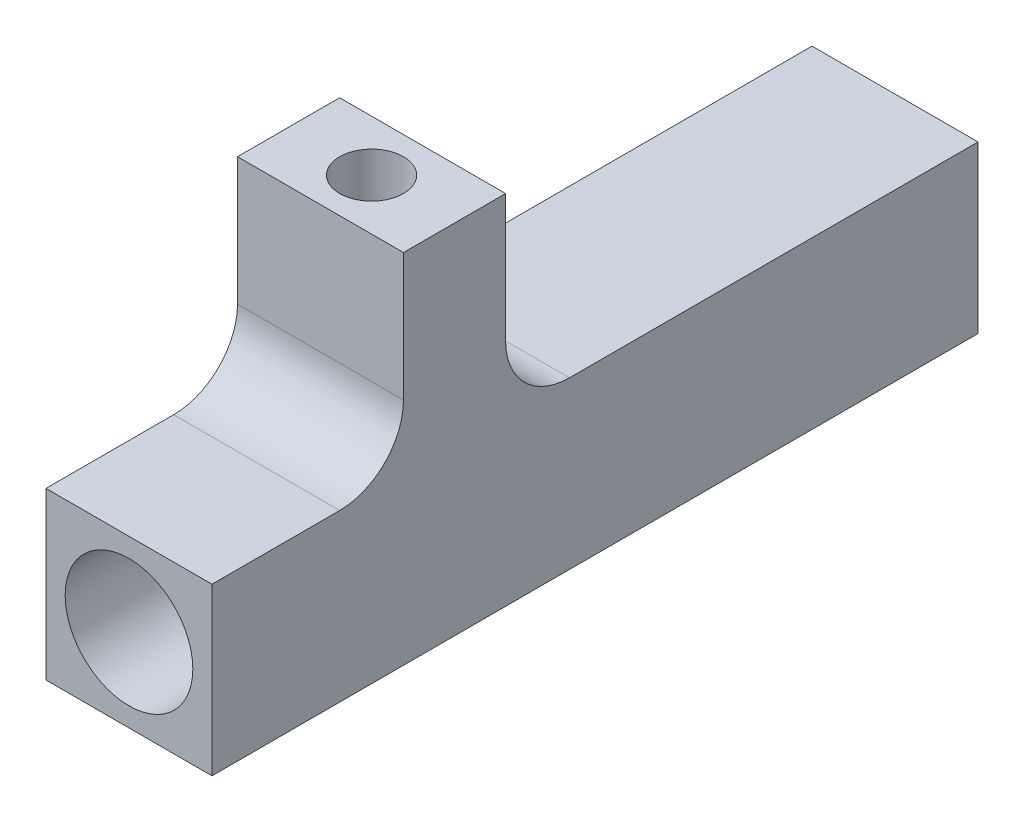
ISO-10303-21;
HEADER;
FILE_DESCRIPTION(('STEP AP214'),'2;1');
FILE_NAME('part.step','',(''),(''),'','','');
FILE_SCHEMA(('AUTOMOTIVE_DESIGN { 1 0 10303 214 1 1 1 1 }'));
ENDSEC;
DATA;
#1=APPLICATION_CONTEXT('core data for automotive mechanical design processes');
#2=APPLICATION_PROTOCOL_DEFINITION('international standard','automotive_design',2000,#1);
#3=PRODUCT_CONTEXT('',#1,'mechanical');
#4=PRODUCT('Part','Part','',(#3));
#5=PRODUCT_RELATED_PRODUCT_CATEGORY('part','',(#4));
#6=PRODUCT_DEFINITION_FORMATION('','',#4);
#7=PRODUCT_DEFINITION_CONTEXT('part definition',#1,'design');
#8=PRODUCT_DEFINITION('design','',#6,#7);
#9=PRODUCT_DEFINITION_SHAPE('','',#8);
#10=(LENGTH_UNIT() NAMED_UNIT(*) SI_UNIT(.MILLI.,.METRE.));
#11=(NAMED_UNIT(*) PLANE_ANGLE_UNIT() SI_UNIT($,.RADIAN.));
#12=(NAMED_UNIT(*) SI_UNIT($,.STERADIAN.) SOLID_ANGLE_UNIT());
#13=UNCERTAINTY_MEASURE_WITH_UNIT(LENGTH_MEASURE(1.E-05),#10,'distance_accuracy_value','');
#14=(GEOMETRIC_REPRESENTATION_CONTEXT(3) GLOBAL_UNCERTAINTY_ASSIGNED_CONTEXT((#13)) GLOBAL_UNIT_ASSIGNED_CONTEXT((#10,
#11,#12)) REPRESENTATION_CONTEXT('',''));
#15=CARTESIAN_POINT('',(0.,0.,0.));
#16=DIRECTION('',(0.,0.,1.));
#17=DIRECTION('',(1.,0.,0.));
#18=AXIS2_PLACEMENT_3D('',#15,#16,#17);
#19=CARTESIAN_POINT('',(13.,13.,19.9999999999999));
#20=DIRECTION('',(0.,0.,-1.));
#21=DIRECTION('',(0.,1.,0.));
#22=AXIS2_PLACEMENT_3D('',#19,#20,#21);
#23=PLANE('',#22);
#24=CARTESIAN_POINT('',(0.,0.,19.9999999999999));
#25=DIRECTION('',(0.,0.,-1.));
#26=DIRECTION('',(0.,1.,0.));
#27=AXIS2_PLACEMENT_3D('',#24,#25,#26);
#28=CIRCLE('',#27,10.);
#29=CARTESIAN_POINT('',(0.,10.,19.9999999999999));
#30=VERTEX_POINT('',#29);
#31=EDGE_CURVE('E158',#30,#30,#28,.T.);
#32=ORIENTED_EDGE('',*,*,#31,.T.);
#33=EDGE_LOOP('',(#32));
#34=FACE_BOUND('',#33,.T.);
#35=DIRECTION('',(-1.,0.,0.));
#36=VECTOR('',#35,1.);
#37=CARTESIAN_POINT('',(13.,13.,19.9999999999999));
#38=LINE('',#37,#36);
#39=CARTESIAN_POINT('',(13.,13.,19.9999999999999));
#40=VERTEX_POINT('',#39);
#41=CARTESIAN_POINT('',(-13.,13.,19.9999999999999));
#42=VERTEX_POINT('',#41);
#43=EDGE_CURVE('E155',#40,#42,#38,.T.);
#44=ORIENTED_EDGE('',*,*,#43,.T.);
#45=DIRECTION('',(0.,-1.,0.));
#46=VECTOR('',#45,1.);
#47=CARTESIAN_POINT('',(-13.,13.,19.9999999999999));
#48=LINE('',#47,#46);
#49=CARTESIAN_POINT('',(-13.,-13.,19.9999999999999));
#50=VERTEX_POINT('',#49);
#51=EDGE_CURVE('E144',#42,#50,#48,.T.);
#52=ORIENTED_EDGE('',*,*,#51,.T.);
#53=DIRECTION('',(-1.,0.,0.));
#54=VECTOR('',#53,1.);
#55=CARTESIAN_POINT('',(13.,-13.,19.9999999999999));
#56=LINE('',#55,#54);
#57=CARTESIAN_POINT('',(13.,-13.,19.9999999999999));
#58=VERTEX_POINT('',#57);
#59=EDGE_CURVE('E13',#58,#50,#56,.T.);
#60=ORIENTED_EDGE('',*,*,#59,.F.);
#61=DIRECTION('',(0.,-1.,0.));
#62=VECTOR('',#61,1.);
#63=CARTESIAN_POINT('',(13.,13.,19.9999999999999));
#64=LINE('',#63,#62);
#65=EDGE_CURVE('E193',#40,#58,#64,.T.);
#66=ORIENTED_EDGE('',*,*,#65,.F.);
#67=EDGE_LOOP('',(#44,#52,#60,#66));
#68=FACE_BOUND('',#67,.T.);
#69=ADVANCED_FACE('F57',(#34,#68),#23,.F.);
#70=CARTESIAN_POINT('',(13.,-13.,0.));
#71=DIRECTION('',(0.,1.,0.));
#72=DIRECTION('',(0.,0.,1.));
#73=AXIS2_PLACEMENT_3D('',#70,#71,#72);
#74=PLANE('',#73);
#75=ORIENTED_EDGE('',*,*,#59,.T.);
#76=DIRECTION('',(0.,0.,-1.));
#77=VECTOR('',#76,1.);
#78=CARTESIAN_POINT('',(-13.,-13.,0.));
#79=LINE('',#78,#77);
#80=CARTESIAN_POINT('',(-13.,-13.,-100.));
#81=VERTEX_POINT('',#80);
#82=EDGE_CURVE('E132',#50,#81,#79,.T.);
#83=ORIENTED_EDGE('',*,*,#82,.T.);
#84=DIRECTION('',(-1.,0.,0.));
#85=VECTOR('',#84,1.);
#86=CARTESIAN_POINT('',(13.,-13.,-100.));
#87=LINE('',#86,#85);
#88=CARTESIAN_POINT('',(13.,-13.,-100.));
#89=VERTEX_POINT('',#88);
#90=EDGE_CURVE('E63',#89,#81,#87,.T.);
#91=ORIENTED_EDGE('',*,*,#90,.F.);
#92=DIRECTION('',(0.,0.,-1.));
#93=VECTOR('',#92,1.);
#94=CARTESIAN_POINT('',(13.,-13.,0.));
#95=LINE('',#94,#93);
#96=EDGE_CURVE('E140',#58,#89,#95,.T.);
#97=ORIENTED_EDGE('',*,*,#96,.F.);
#98=EDGE_LOOP('',(#75,#83,#91,#97));
#99=FACE_BOUND('',#98,.T.);
#100=ADVANCED_FACE('F135',(#99),#74,.F.);
#101=CARTESIAN_POINT('',(13.,13.,-100.));
#102=DIRECTION('',(0.,0.,1.));
#103=DIRECTION('',(0.,-1.,0.));
#104=AXIS2_PLACEMENT_3D('',#101,#102,#103);
#105=PLANE('',#104);
#106=CARTESIAN_POINT('',(0.,0.,-100.));
#107=DIRECTION('',(0.,0.,1.));
#108=DIRECTION('',(0.,-1.,0.));
#109=AXIS2_PLACEMENT_3D('',#106,#107,#108);
#110=CIRCLE('',#109,10.);
#111=CARTESIAN_POINT('',(0.,-10.,-100.));
#112=VERTEX_POINT('',#111);
#113=EDGE_CURVE('E152',#112,#112,#110,.F.);
#114=ORIENTED_EDGE('',*,*,#113,.F.);
#115=EDGE_LOOP('',(#114));
#116=FACE_BOUND('',#115,.T.);
#117=ORIENTED_EDGE('',*,*,#90,.T.);
#118=DIRECTION('',(0.,1.,0.));
#119=VECTOR('',#118,1.);
#120=CARTESIAN_POINT('',(-13.,13.,-100.));
#121=LINE('',#120,#119);
#122=CARTESIAN_POINT('',(-13.,13.,-100.));
#123=VERTEX_POINT('',#122);
#124=EDGE_CURVE('E149',#81,#123,#121,.T.);
#125=ORIENTED_EDGE('',*,*,#124,.T.);
#126=DIRECTION('',(-1.,0.,0.));
#127=VECTOR('',#126,1.);
#128=CARTESIAN_POINT('',(13.,13.,-100.));
#129=LINE('',#128,#127);
#130=CARTESIAN_POINT('',(13.,13.,-100.));
#131=VERTEX_POINT('',#130);
#132=EDGE_CURVE('E236',#131,#123,#129,.T.);
#133=ORIENTED_EDGE('',*,*,#132,.F.);
#134=DIRECTION('',(0.,1.,0.));
#135=VECTOR('',#134,1.);
#136=CARTESIAN_POINT('',(13.,13.,-100.));
#137=LINE('',#136,#135);
#138=EDGE_CURVE('E198',#89,#131,#137,.T.);
#139=ORIENTED_EDGE('',*,*,#138,.F.);
#140=EDGE_LOOP('',(#117,#125,#133,#139));
#141=FACE_BOUND('',#140,.T.);
#142=ADVANCED_FACE('F245',(#116,#141),#105,.F.);
#143=CARTESIAN_POINT('',(13.,13.,-36.));
#144=DIRECTION('',(0.,-1.,0.));
#145=DIRECTION('',(0.,0.,-1.));
#146=AXIS2_PLACEMENT_3D('',#143,#144,#145);
#147=PLANE('',#146);
#148=ORIENTED_EDGE('',*,*,#132,.T.);
#149=DIRECTION('',(0.,0.,1.));
#150=VECTOR('',#149,1.);
#151=CARTESIAN_POINT('',(-13.,13.,-36.));
#152=LINE('',#151,#150);
#153=CARTESIAN_POINT('',(-13.,13.,-36.));
#154=VERTEX_POINT('',#153);
#155=EDGE_CURVE('E163',#123,#154,#152,.T.);
#156=ORIENTED_EDGE('',*,*,#155,.T.);
#157=DIRECTION('',(-1.,0.,0.));
#158=VECTOR('',#157,1.);
#159=CARTESIAN_POINT('',(13.,13.,-36.));
#160=LINE('',#159,#158);
#161=CARTESIAN_POINT('',(13.,13.,-36.));
#162=VERTEX_POINT('',#161);
#163=EDGE_CURVE('E232',#162,#154,#160,.T.);
#164=ORIENTED_EDGE('',*,*,#163,.F.);
#165=DIRECTION('',(0.,0.,1.));
#166=VECTOR('',#165,1.);
#167=CARTESIAN_POINT('',(13.,13.,-36.));
#168=LINE('',#167,#166);
#169=EDGE_CURVE('E200',#131,#162,#168,.T.);
#170=ORIENTED_EDGE('',*,*,#169,.F.);
#171=EDGE_LOOP('',(#148,#156,#164,#170));
#172=FACE_BOUND('',#171,.T.);
#173=ADVANCED_FACE('F253',(#172),#147,.F.);
#174=CARTESIAN_POINT('',(13.,23.,-36.));
#175=DIRECTION('',(-1.,0.,0.));
#176=DIRECTION('',(0.,0.,1.));
#177=AXIS2_PLACEMENT_3D('',#174,#175,#176);
#178=CYLINDRICAL_SURFACE('',#177,10.);
#179=ORIENTED_EDGE('',*,*,#163,.T.);
#180=CARTESIAN_POINT('',(-13.,23.,-36.));
#181=DIRECTION('',(-1.,0.,0.));
#182=DIRECTION('',(0.,0.,1.));
#183=AXIS2_PLACEMENT_3D('',#180,#181,#182);
#184=CIRCLE('',#183,10.);
#185=CARTESIAN_POINT('',(-13.,23.,-26.));
#186=VERTEX_POINT('',#185);
#187=EDGE_CURVE('E169',#154,#186,#184,.T.);
#188=ORIENTED_EDGE('',*,*,#187,.T.);
#189=DIRECTION('',(-1.,0.,0.));
#190=VECTOR('',#189,1.);
#191=CARTESIAN_POINT('',(13.,23.,-26.));
#192=LINE('',#191,#190);
#193=CARTESIAN_POINT('',(13.,23.,-26.));
#194=VERTEX_POINT('',#193);
#195=EDGE_CURVE('E235',#194,#186,#192,.T.);
#196=ORIENTED_EDGE('',*,*,#195,.F.);
#197=CARTESIAN_POINT('',(13.,23.,-36.));
#198=DIRECTION('',(-1.,0.,0.));
#199=DIRECTION('',(0.,0.,1.));
#200=AXIS2_PLACEMENT_3D('',#197,#198,#199);
#201=CIRCLE('',#200,10.);
#202=EDGE_CURVE('E205',#162,#194,#201,.T.);
#203=ORIENTED_EDGE('',*,*,#202,.F.);
#204=EDGE_LOOP('',(#179,#188,#196,#203));
#205=FACE_BOUND('',#204,.T.);
#206=ADVANCED_FACE('F255',(#205),#178,.F.);
#207=CARTESIAN_POINT('',(13.,23.,-26.));
#208=DIRECTION('',(0.,0.,1.));
#209=DIRECTION('',(0.,-1.,0.));
#210=AXIS2_PLACEMENT_3D('',#207,#208,#209);
#211=PLANE('',#210);
#212=ORIENTED_EDGE('',*,*,#195,.T.);
#213=DIRECTION('',(0.,1.,0.));
#214=VECTOR('',#213,1.);
#215=CARTESIAN_POINT('',(-13.,23.,-26.));
#216=LINE('',#215,#214);
#217=CARTESIAN_POINT('',(-13.,43.,-26.0000000000001));
#218=VERTEX_POINT('',#217);
#219=EDGE_CURVE('E171',#186,#218,#216,.T.);
#220=ORIENTED_EDGE('',*,*,#219,.T.);
#221=DIRECTION('',(-1.,0.,0.));
#222=VECTOR('',#221,1.);
#223=CARTESIAN_POINT('',(13.,43.,-26.0000000000001));
#224=LINE('',#223,#222);
#225=CARTESIAN_POINT('',(13.,43.,-26.0000000000001));
#226=VERTEX_POINT('',#225);
#227=EDGE_CURVE('E228',#226,#218,#224,.T.);
#228=ORIENTED_EDGE('',*,*,#227,.F.);
#229=DIRECTION('',(0.,1.,0.));
#230=VECTOR('',#229,1.);
#231=CARTESIAN_POINT('',(13.,23.,-26.));
#232=LINE('',#231,#230);
#233=EDGE_CURVE('E202',#194,#226,#232,.T.);
#234=ORIENTED_EDGE('',*,*,#233,.F.);
#235=EDGE_LOOP('',(#212,#220,#228,#234));
#236=FACE_BOUND('',#235,.T.);
#237=ADVANCED_FACE('F259',(#236),#211,.F.);
#238=CARTESIAN_POINT('',(13.,43.,-10.0000000000001));
#239=DIRECTION('',(0.,-1.,0.));
#240=DIRECTION('',(0.,0.,-1.));
#241=AXIS2_PLACEMENT_3D('',#238,#239,#240);
#242=PLANE('',#241);
#243=CARTESIAN_POINT('',(0.,43.,-18.));
#244=DIRECTION('',(0.,1.,0.));
#245=DIRECTION('',(0.,0.,1.));
#246=AXIS2_PLACEMENT_3D('',#243,#244,#245);
#247=CIRCLE('',#246,5.);
#248=CARTESIAN_POINT('',(0.,43.,-13.));
#249=VERTEX_POINT('',#248);
#250=EDGE_CURVE('E296',#249,#249,#247,.T.);
#251=ORIENTED_EDGE('',*,*,#250,.F.);
#252=EDGE_LOOP('',(#251));
#253=FACE_BOUND('',#252,.T.);
#254=ORIENTED_EDGE('',*,*,#227,.T.);
#255=DIRECTION('',(0.,0.,1.));
#256=VECTOR('',#255,1.);
#257=CARTESIAN_POINT('',(-13.,43.,-10.0000000000001));
#258=LINE('',#257,#256);
#259=CARTESIAN_POINT('',(-13.,43.,-10.0000000000001));
#260=VERTEX_POINT('',#259);
#261=EDGE_CURVE('E178',#218,#260,#258,.T.);
#262=ORIENTED_EDGE('',*,*,#261,.T.);
#263=DIRECTION('',(-1.,0.,0.));
#264=VECTOR('',#263,1.);
#265=CARTESIAN_POINT('',(13.,43.,-10.0000000000001));
#266=LINE('',#265,#264);
#267=CARTESIAN_POINT('',(13.,43.,-10.0000000000001));
#268=VERTEX_POINT('',#267);
#269=EDGE_CURVE('E229',#268,#260,#266,.T.);
#270=ORIENTED_EDGE('',*,*,#269,.F.);
#271=DIRECTION('',(0.,0.,1.));
#272=VECTOR('',#271,1.);
#273=CARTESIAN_POINT('',(13.,43.,-10.0000000000001));
#274=LINE('',#273,#272);
#275=EDGE_CURVE('E208',#226,#268,#274,.T.);
#276=ORIENTED_EDGE('',*,*,#275,.F.);
#277=EDGE_LOOP('',(#254,#262,#270,#276));
#278=FACE_BOUND('',#277,.T.);
#279=ADVANCED_FACE('F264',(#253,#278),#242,.F.);
#280=CARTESIAN_POINT('',(13.,23.,-10.0000000000001));
#281=DIRECTION('',(0.,0.,-1.));
#282=DIRECTION('',(-1.,0.,0.));
#283=AXIS2_PLACEMENT_3D('',#280,#281,#282);
#284=PLANE('',#283);
#285=ORIENTED_EDGE('',*,*,#269,.T.);
#286=DIRECTION('',(0.,-1.,0.));
#287=VECTOR('',#286,1.);
#288=CARTESIAN_POINT('',(-13.,23.,-10.0000000000001));
#289=LINE('',#288,#287);
#290=CARTESIAN_POINT('',(-13.,23.,-10.0000000000001));
#291=VERTEX_POINT('',#290);
#292=EDGE_CURVE('E177',#260,#291,#289,.T.);
#293=ORIENTED_EDGE('',*,*,#292,.T.);
#294=DIRECTION('',(-1.,0.,0.));
#295=VECTOR('',#294,1.);
#296=CARTESIAN_POINT('',(13.,23.,-10.0000000000001));
#297=LINE('',#296,#295);
#298=CARTESIAN_POINT('',(13.,23.,-10.0000000000001));
#299=VERTEX_POINT('',#298);
#300=EDGE_CURVE('E224',#299,#291,#297,.T.);
#301=ORIENTED_EDGE('',*,*,#300,.F.);
#302=DIRECTION('',(0.,-1.,0.));
#303=VECTOR('',#302,1.);
#304=CARTESIAN_POINT('',(13.,23.,-10.0000000000001));
#305=LINE('',#304,#303);
#306=EDGE_CURVE('E211',#268,#299,#305,.T.);
#307=ORIENTED_EDGE('',*,*,#306,.F.);
#308=EDGE_LOOP('',(#285,#293,#301,#307));
#309=FACE_BOUND('',#308,.T.);
#310=ADVANCED_FACE('F267',(#309),#284,.F.);
#311=CARTESIAN_POINT('',(13.,23.,0.));
#312=DIRECTION('',(-1.,0.,0.));
#313=DIRECTION('',(0.,0.,1.));
#314=AXIS2_PLACEMENT_3D('',#311,#312,#313);
#315=CYLINDRICAL_SURFACE('',#314,10.);
#316=ORIENTED_EDGE('',*,*,#300,.T.);
#317=CARTESIAN_POINT('',(-13.,23.,0.));
#318=DIRECTION('',(-1.,0.,0.));
#319=DIRECTION('',(0.,0.,-1.));
#320=AXIS2_PLACEMENT_3D('',#317,#318,#319);
#321=CIRCLE('',#320,10.);
#322=CARTESIAN_POINT('',(-13.,13.,0.));
#323=VERTEX_POINT('',#322);
#324=EDGE_CURVE('E184',#291,#323,#321,.T.);
#325=ORIENTED_EDGE('',*,*,#324,.T.);
#326=DIRECTION('',(-1.,0.,0.));
#327=VECTOR('',#326,1.);
#328=CARTESIAN_POINT('',(13.,13.,0.));
#329=LINE('',#328,#327);
#330=CARTESIAN_POINT('',(13.,13.,0.));
#331=VERTEX_POINT('',#330);
#332=EDGE_CURVE('E219',#331,#323,#329,.T.);
#333=ORIENTED_EDGE('',*,*,#332,.F.);
#334=CARTESIAN_POINT('',(13.,23.,0.));
#335=DIRECTION('',(-1.,0.,0.));
#336=DIRECTION('',(0.,0.,-1.));
#337=AXIS2_PLACEMENT_3D('',#334,#335,#336);
#338=CIRCLE('',#337,10.);
#339=EDGE_CURVE('E79',#299,#331,#338,.T.);
#340=ORIENTED_EDGE('',*,*,#339,.F.);
#341=EDGE_LOOP('',(#316,#325,#333,#340));
#342=FACE_BOUND('',#341,.T.);
#343=ADVANCED_FACE('F275',(#342),#315,.F.);
#344=CARTESIAN_POINT('',(13.,13.,0.));
#345=DIRECTION('',(0.,-1.,0.));
#346=DIRECTION('',(0.,0.,-1.));
#347=AXIS2_PLACEMENT_3D('',#344,#345,#346);
#348=PLANE('',#347);
#349=ORIENTED_EDGE('',*,*,#332,.T.);
#350=DIRECTION('',(0.,0.,1.));
#351=VECTOR('',#350,1.);
#352=CARTESIAN_POINT('',(-13.,13.,0.));
#353=LINE('',#352,#351);
#354=EDGE_CURVE('E190',#323,#42,#353,.T.);
#355=ORIENTED_EDGE('',*,*,#354,.T.);
#356=ORIENTED_EDGE('',*,*,#43,.F.);
#357=DIRECTION('',(0.,0.,1.));
#358=VECTOR('',#357,1.);
#359=CARTESIAN_POINT('',(13.,13.,0.));
#360=LINE('',#359,#358);
#361=EDGE_CURVE('E72',#331,#40,#360,.T.);
#362=ORIENTED_EDGE('',*,*,#361,.F.);
#363=EDGE_LOOP('',(#349,#355,#356,#362));
#364=FACE_BOUND('',#363,.T.);
#365=ADVANCED_FACE('F273',(#364),#348,.F.);
#366=CARTESIAN_POINT('',(13.,23.,-36.));
#367=DIRECTION('',(-1.,0.,0.));
#368=DIRECTION('',(0.,0.,1.));
#369=AXIS2_PLACEMENT_3D('',#366,#367,#368);
#370=PLANE('',#369);
#371=ORIENTED_EDGE('',*,*,#65,.T.);
#372=ORIENTED_EDGE('',*,*,#96,.T.);
#373=ORIENTED_EDGE('',*,*,#138,.T.);
#374=ORIENTED_EDGE('',*,*,#169,.T.);
#375=ORIENTED_EDGE('',*,*,#202,.T.);
#376=ORIENTED_EDGE('',*,*,#233,.T.);
#377=ORIENTED_EDGE('',*,*,#275,.T.);
#378=ORIENTED_EDGE('',*,*,#306,.T.);
#379=ORIENTED_EDGE('',*,*,#339,.T.);
#380=ORIENTED_EDGE('',*,*,#361,.T.);
#381=EDGE_LOOP('',(#371,#372,#373,#374,#375,#376,#377,#378,#379,#380));
#382=FACE_BOUND('',#381,.T.);
#383=ADVANCED_FACE('F248',(#382),#370,.F.);
#384=CARTESIAN_POINT('',(-13.,23.,-36.));
#385=DIRECTION('',(-1.,0.,0.));
#386=DIRECTION('',(0.,0.,1.));
#387=AXIS2_PLACEMENT_3D('',#384,#385,#386);
#388=PLANE('',#387);
#389=ORIENTED_EDGE('',*,*,#51,.F.);
#390=ORIENTED_EDGE('',*,*,#354,.F.);
#391=ORIENTED_EDGE('',*,*,#324,.F.);
#392=ORIENTED_EDGE('',*,*,#292,.F.);
#393=ORIENTED_EDGE('',*,*,#261,.F.);
#394=ORIENTED_EDGE('',*,*,#219,.F.);
#395=ORIENTED_EDGE('',*,*,#187,.F.);
#396=ORIENTED_EDGE('',*,*,#155,.F.);
#397=ORIENTED_EDGE('',*,*,#124,.F.);
#398=ORIENTED_EDGE('',*,*,#82,.F.);
#399=EDGE_LOOP('',(#389,#390,#391,#392,#393,#394,#395,#396,#397,#398));
#400=FACE_BOUND('',#399,.T.);
#401=ADVANCED_FACE('F141',(#400),#388,.T.);
#402=CARTESIAN_POINT('',(0.,0.,-128.284271247462));
#403=DIRECTION('',(0.,0.,1.));
#404=DIRECTION('',(1.,0.,0.));
#405=AXIS2_PLACEMENT_3D('',#402,#403,#404);
#406=CYLINDRICAL_SURFACE('',#405,10.);
#407=CARTESIAN_POINT('',(0.,10.,-13.));
#408=CARTESIAN_POINT('',(-0.131488890078727,9.99999960171885,-13.0000004322161));
#409=CARTESIAN_POINT('',(-0.26298697021715,9.99740053121284,-13.0051927752852));
#410=CARTESIAN_POINT('',(-0.525014586348055,9.98706977835168,-13.0259028941121));
#411=CARTESIAN_POINT('',(-0.655543676003293,9.97933586314931,-13.041425161764));
#412=CARTESIAN_POINT('',(-0.914783203431132,9.95892066969002,-13.0826407794774));
#413=CARTESIAN_POINT('',(-1.04349077535257,9.94623233642882,-13.1083486344063));
#414=CARTESIAN_POINT('',(-1.29802636754293,9.91622716576671,-13.1696506725635));
#415=CARTESIAN_POINT('',(-1.42385318781692,9.89890843630383,-13.2052488974057));
#416=CARTESIAN_POINT('',(-1.67121386584967,9.86015430154804,-13.2857784824513));
#417=CARTESIAN_POINT('',(-1.79276399094561,9.83873709670758,-13.3306686485481));
#418=CARTESIAN_POINT('',(-2.0314444775119,9.79224427489324,-13.429448797807));
#419=CARTESIAN_POINT('',(-2.14857315511665,9.7671672814684,-13.4833421681935));
#420=CARTESIAN_POINT('',(-2.49222561412914,9.68730860488736,-13.657799628939));
#421=CARTESIAN_POINT('',(-2.71128846115304,9.6278546021617,-13.7912307732401));
#422=CARTESIAN_POINT('',(-3.13758045755123,9.49780663424161,-14.0976052812446));
#423=CARTESIAN_POINT('',(-3.34329192972867,9.42675632671347,-14.2724506902798));
#424=CARTESIAN_POINT('',(-3.72388133818108,9.28300214475254,-14.6525890882832));
#425=CARTESIAN_POINT('',(-3.89873577832563,9.21029705743543,-14.8579050619839));
#426=CARTESIAN_POINT('',(-4.22628385620054,9.06493867332993,-15.3124751474643));
#427=CARTESIAN_POINT('',(-4.37620734766693,8.99272664170302,-15.5639018913175));
#428=CARTESIAN_POINT('',(-4.56723365243868,8.89637417546677,-15.9599180443676));
#429=CARTESIAN_POINT('',(-4.62527981130997,8.86624279684719,-16.0951182905603));
#430=CARTESIAN_POINT('',(-4.72948843578256,8.81109611627222,-16.3710012517741));
#431=CARTESIAN_POINT('',(-4.77565793744269,8.78607778701963,-16.5116806636392));
#432=CARTESIAN_POINT('',(-4.8531380584616,8.74350562362059,-16.788992754156));
#433=CARTESIAN_POINT('',(-4.88516762296958,8.72559704108876,-16.925370479978));
#434=CARTESIAN_POINT('',(-4.93772573892405,8.69596333711106,-17.2009256974797));
#435=CARTESIAN_POINT('',(-4.95826039236648,8.68423493515241,-17.3401016630062));
#436=CARTESIAN_POINT('',(-4.98752398958936,8.66746161087014,-17.6200074611113));
#437=CARTESIAN_POINT('',(-4.99626004329765,8.66241266349288,-17.7607363063142));
#438=CARTESIAN_POINT('',(-5.00180399494054,8.65921299638945,-18.0425011762897));
#439=CARTESIAN_POINT('',(-4.99861303092504,8.66106161851229,-18.1835371704714));
#440=CARTESIAN_POINT('',(-4.98145803092846,8.67093727173593,-18.447703572877));
#441=CARTESIAN_POINT('',(-4.96883208371091,8.6781966350113,-18.5709526028102));
#442=CARTESIAN_POINT('',(-4.93454402662215,8.69773906996623,-18.8158212139672));
#443=CARTESIAN_POINT('',(-4.91287907868334,8.71002371946268,-18.937440271022));
#444=CARTESIAN_POINT('',(-4.86076278292653,8.73921479576949,-19.1781978743128));
#445=CARTESIAN_POINT('',(-4.83031251988904,8.75612065195561,-19.2973367248501));
#446=CARTESIAN_POINT('',(-4.76094319159973,8.79403073984606,-19.5324713769544));
#447=CARTESIAN_POINT('',(-4.72202079856857,8.81503658165343,-19.6484659232761));
#448=CARTESIAN_POINT('',(-4.59108661358501,8.88436032421636,-19.9960068716187));
#449=CARTESIAN_POINT('',(-4.48608785825886,8.93828791833521,-20.2216933560379));
#450=CARTESIAN_POINT('',(-4.24519591002764,9.05517433078603,-20.6532101182229));
#451=CARTESIAN_POINT('',(-4.10928884013354,9.11813720101033,-20.8590314177593));
#452=CARTESIAN_POINT('',(-3.79034422310328,9.2556545575908,-21.2725885282038));
#453=CARTESIAN_POINT('',(-3.60351571642877,9.3306665420313,-21.4772580077073));
#454=CARTESIAN_POINT('',(-3.19773444843253,9.47739013910051,-21.8537034656888));
#455=CARTESIAN_POINT('',(-2.97876642220598,9.54910016205801,-22.0254637238213));
#456=CARTESIAN_POINT('',(-2.62430600098781,9.65034506582221,-22.2584408971132));
#457=CARTESIAN_POINT('',(-2.49871002336159,9.68370380274256,-22.3333520951456));
#458=CARTESIAN_POINT('',(-2.2407106014256,9.74663052718473,-22.4722082029725));
#459=CARTESIAN_POINT('',(-2.1083100575541,9.77620011135783,-22.5361577355912));
#460=CARTESIAN_POINT('',(-1.83762803314804,9.83067553510546,-22.6523988753834));
#461=CARTESIAN_POINT('',(-1.69934894682178,9.85558325144946,-22.7046951755248));
#462=CARTESIAN_POINT('',(-1.41791187896083,9.89999026457503,-22.79702492908));
#463=CARTESIAN_POINT('',(-1.27475446078987,9.91949018350378,-22.8370597931822));
#464=CARTESIAN_POINT('',(-0.996798015430412,9.95109597328192,-22.9015335635031));
#465=CARTESIAN_POINT('',(-0.862288674029797,9.96368046334326,-22.9269895154025));
#466=CARTESIAN_POINT('',(-0.591248360012465,9.98343035732268,-22.9668080412237));
#467=CARTESIAN_POINT('',(-0.454717567193951,9.99059624028198,-22.9811715957901));
#468=CARTESIAN_POINT('',(-0.180810709359646,9.99930380487356,-22.9986131620341));
#469=CARTESIAN_POINT('',(-0.0434349881358988,10.000847639673,-23.001695494267));
#470=CARTESIAN_POINT('',(0.231047608581552,9.99827237859039,-22.9965444260813));
#471=CARTESIAN_POINT('',(0.368154495704341,9.99415353332644,-22.9883115264507));
#472=CARTESIAN_POINT('',(0.630324023952246,9.98090973082445,-22.961721326159));
#473=CARTESIAN_POINT('',(0.755493751243219,9.97219922243105,-22.9442016224067));
#474=CARTESIAN_POINT('',(1.00380426086804,9.95027227352716,-22.8998255264294));
#475=CARTESIAN_POINT('',(1.12694438760008,9.93705440583578,-22.8729661769068));
#476=CARTESIAN_POINT('',(1.37032307172126,9.90642450404115,-22.8101973166375));
#477=CARTESIAN_POINT('',(1.49056250470176,9.88901375346268,-22.7742905753219));
#478=CARTESIAN_POINT('',(1.72747946867538,9.85039368148873,-22.6937718386769));
#479=CARTESIAN_POINT('',(1.84415561535681,9.82918290524069,-22.6491565086474));
#480=CARTESIAN_POINT('',(2.19430354472275,9.75922876416581,-22.5000521931498));
#481=CARTESIAN_POINT('',(2.42111320848944,9.70504904478179,-22.382059258215));
#482=CARTESIAN_POINT('',(2.8523456015808,9.58719375745592,-22.1144478067804));
#483=CARTESIAN_POINT('',(3.05675873773467,9.5235141477638,-21.9648158180077));
#484=CARTESIAN_POINT('',(3.45882132675025,9.38541505392103,-21.6212127089634));
#485=CARTESIAN_POINT('',(3.65383533419946,9.31055499361995,-21.4243304082476));
#486=CARTESIAN_POINT('',(4.00930667677968,9.16310881759143,-21.0003294628661));
#487=CARTESIAN_POINT('',(4.16974010650665,9.09052430437331,-20.7731900760017));
#488=CARTESIAN_POINT('',(4.38466016919211,8.98785260582618,-20.4075094337708));
#489=CARTESIAN_POINT('',(4.4532676226712,8.95395955241383,-20.2781491254566));
#490=CARTESIAN_POINT('',(4.57918112262684,8.89022352415078,-20.0131058992211));
#491=CARTESIAN_POINT('',(4.63649228788887,8.86037871680369,-19.8774258796241));
#492=CARTESIAN_POINT('',(4.73913999074899,8.80590327365628,-19.6007229646748));
#493=CARTESIAN_POINT('',(4.78448631442401,8.78126837994728,-19.45970454425));
#494=CARTESIAN_POINT('',(4.86265004333096,8.73822819098157,-19.1733089571752));
#495=CARTESIAN_POINT('',(4.89546938847112,8.7198219312185,-19.0279324691725));
#496=CARTESIAN_POINT('',(4.94553834792943,8.69151275671387,-18.7482350184648));
#497=CARTESIAN_POINT('',(4.96397997433445,8.6809632703526,-18.6141921168801));
#498=CARTESIAN_POINT('',(4.98993873206133,8.66606824539577,-18.3447147543027));
#499=CARTESIAN_POINT('',(4.99745700797003,8.66172205679783,-18.2092804406048));
#500=CARTESIAN_POINT('',(5.00145477351749,8.65941425656731,-17.9382430749954));
#501=CARTESIAN_POINT('',(4.99793814327599,8.66145040076354,-17.8026400991504));
#502=CARTESIAN_POINT('',(4.97992974203947,8.67181681785816,-17.5324144420522));
#503=CARTESIAN_POINT('',(4.96543842034337,8.68014683308828,-17.3977917208955));
#504=CARTESIAN_POINT('',(4.92759757627216,8.70167828744801,-17.143439797841));
#505=CARTESIAN_POINT('',(4.90522766015001,8.71433770908853,-17.0235174403761));
#506=CARTESIAN_POINT('',(4.85194376743194,8.74411599480516,-16.7861388094326));
#507=CARTESIAN_POINT('',(4.82102714868723,8.76123623781642,-16.668683310666));
#508=CARTESIAN_POINT('',(4.71590306073959,8.81854231868724,-16.3210828848871));
#509=CARTESIAN_POINT('',(4.62929708984156,8.86468813771129,-16.0955439050141));
#510=CARTESIAN_POINT('',(4.41907164675021,8.97142890954605,-15.6468396576875));
#511=CARTESIAN_POINT('',(4.29335633682032,9.03278633647388,-15.4248519240107));
#512=CARTESIAN_POINT('',(4.01075421010745,9.16176636495219,-15.0036358904043));
#513=CARTESIAN_POINT('',(3.85385117607732,9.22939221620456,-14.8044195165559));
#514=CARTESIAN_POINT('',(3.49102748964406,9.37311444600789,-14.4092921415293));
#515=CARTESIAN_POINT('',(3.28146736342599,9.44924162905911,-14.2167239812324));
#516=CARTESIAN_POINT('',(2.83072875767415,9.59389514971535,-13.8686655788168));
#517=CARTESIAN_POINT('',(2.58953334336126,9.66241737976037,-13.7131953222565));
#518=CARTESIAN_POINT('',(2.20753881885374,9.7541901337583,-13.5113695854732));
#519=CARTESIAN_POINT('',(2.07625512570271,9.78304209980293,-13.4491329205937));
#520=CARTESIAN_POINT('',(1.80799529933999,9.83614745234555,-13.3360638438797));
#521=CARTESIAN_POINT('',(1.67102200205152,9.8604030970797,-13.2852258294694));
#522=CARTESIAN_POINT('',(1.39269501068688,9.90354484128718,-13.1956545616329));
#523=CARTESIAN_POINT('',(1.25135162347081,9.92244264379385,-13.1568949070123));
#524=CARTESIAN_POINT('',(0.965237205795558,9.95434618112011,-13.0918624037315));
#525=CARTESIAN_POINT('',(0.820468326048373,9.96735551489675,-13.065581927473));
#526=CARTESIAN_POINT('',(0.56304165440816,9.98476387878718,-13.0305254680012));
#527=CARTESIAN_POINT('',(0.450825809730025,9.99046741601666,-13.019088246308));
#528=CARTESIAN_POINT('',(0.225742246050266,9.99808569986015,-13.0038252217499));
#529=CARTESIAN_POINT('',(0.112874509142189,10.000000341898,-12.9999996289712));
#530=CARTESIAN_POINT('',(0.,10.,-13.));
#531=B_SPLINE_CURVE_WITH_KNOTS('',3,(#407,#408,#409,#410,#411,#412,#413,#414,#415,#416,#417,
#418,#419,#420,#421,#422,#423,#424,#425,#426,#427,#428,#429,#430,#431,#432,#433,#434,#435,#436,
#437,#438,#439,#440,#441,#442,#443,#444,#445,#446,#447,#448,#449,#450,#451,#452,#453,#454,#455,
#456,#457,#458,#459,#460,#461,#462,#463,#464,#465,#466,#467,#468,#469,#470,#471,#472,#473,#474,
#475,#476,#477,#478,#479,#480,#481,#482,#483,#484,#485,#486,#487,#488,#489,#490,#491,#492,#493,
#494,#495,#496,#497,#498,#499,#500,#501,#502,#503,#504,#505,#506,#507,#508,#509,#510,#511,#512,
#513,#514,#515,#516,#517,#518,#519,#520,#521,#522,#523,#524,#525,#526,#527,#528,#529,#530),
.UNSPECIFIED.,.T.,.F.,(4,2,2,2,2,2,2,2,2,2,2,2,2,2,2,2,2,2,2,2,2,2,2,2,2,2,2,2,2,2,2,2,2,2,2,2,
2,2,2,2,2,2,2,2,2,2,2,2,2,2,2,2,2,2,2,2,2,2,2,2,2,4),(0.,0.39435529464989,0.788882184037817,
1.18397293369035,1.57922537181693,1.97276168530542,2.36644639154632,3.15295441699266,
3.98704440767527,4.821766802355,5.72122193562246,6.17125359989459,6.62101803579305,
7.04410338623951,7.46696393118358,7.88956954321096,8.3121348321667,8.68401534897462,
9.05601271689169,9.42796417149685,9.8000619899096,10.56083380205,11.3219478566368,
12.1795688603196,13.03759852356,13.4870830845772,13.9363776171859,14.3854908824168,
14.8345524573652,15.2464230691107,15.6582572644723,16.0699337163998,16.4815919489941,
16.8612200640511,17.240968493866,17.6206008225791,18.0003788066131,18.7808755264614,
19.5617052624835,20.4192132572739,21.2773121558255,21.7277011924366,22.1778856687596,
22.6277007885002,23.0774462222894,23.4840267197959,23.8905646113036,24.2969595710184,
24.703337894006,25.0708552370355,25.4384863225851,26.1732662495599,26.9574126491567,
27.7419678673239,28.6218519479817,29.5022089791541,29.9460734671028,30.3897193096443,
30.8323885049027,31.2747867798493,31.6133053554877,31.9518332743451),.UNSPECIFIED.);
#532=CARTESIAN_POINT('',(0.,10.,-13.));
#533=VERTEX_POINT('',#532);
#534=EDGE_CURVE('E294',#533,#533,#531,.T.);
#535=ORIENTED_EDGE('',*,*,#534,.F.);
#536=EDGE_LOOP('',(#535));
#537=FACE_BOUND('',#536,.T.);
#538=ORIENTED_EDGE('',*,*,#113,.T.);
#539=EDGE_LOOP('',(#538));
#540=FACE_BOUND('',#539,.T.);
#541=ORIENTED_EDGE('',*,*,#31,.F.);
#542=EDGE_LOOP('',(#541));
#543=FACE_BOUND('',#542,.T.);
#544=ADVANCED_FACE('F309',(#537,#540,#543),#406,.F.);
#545=CARTESIAN_POINT('',(0.,-13.001,-18.));
#546=DIRECTION('',(0.,1.,0.));
#547=DIRECTION('',(0.,0.,1.));
#548=AXIS2_PLACEMENT_3D('',#545,#546,#547);
#549=CYLINDRICAL_SURFACE('',#548,5.);
#550=ORIENTED_EDGE('',*,*,#534,.T.);
#551=EDGE_LOOP('',(#550));
#552=FACE_BOUND('',#551,.T.);
#553=ORIENTED_EDGE('',*,*,#250,.T.);
#554=EDGE_LOOP('',(#553));
#555=FACE_BOUND('',#554,.T.);
#556=ADVANCED_FACE('F302',(#552,#555),#549,.F.);
#557=CLOSED_SHELL('',(#69,#100,#142,#173,#206,#237,#279,#310,#343,#365,#383,#401,#544,#556));
#558=MANIFOLD_SOLID_BREP('B2',#557);
#559=ADVANCED_BREP_SHAPE_REPRESENTATION('',(#18,#558),#14);
#560=SHAPE_DEFINITION_REPRESENTATION(#9,#559);
ENDSEC;
END-ISO-10303-21;
